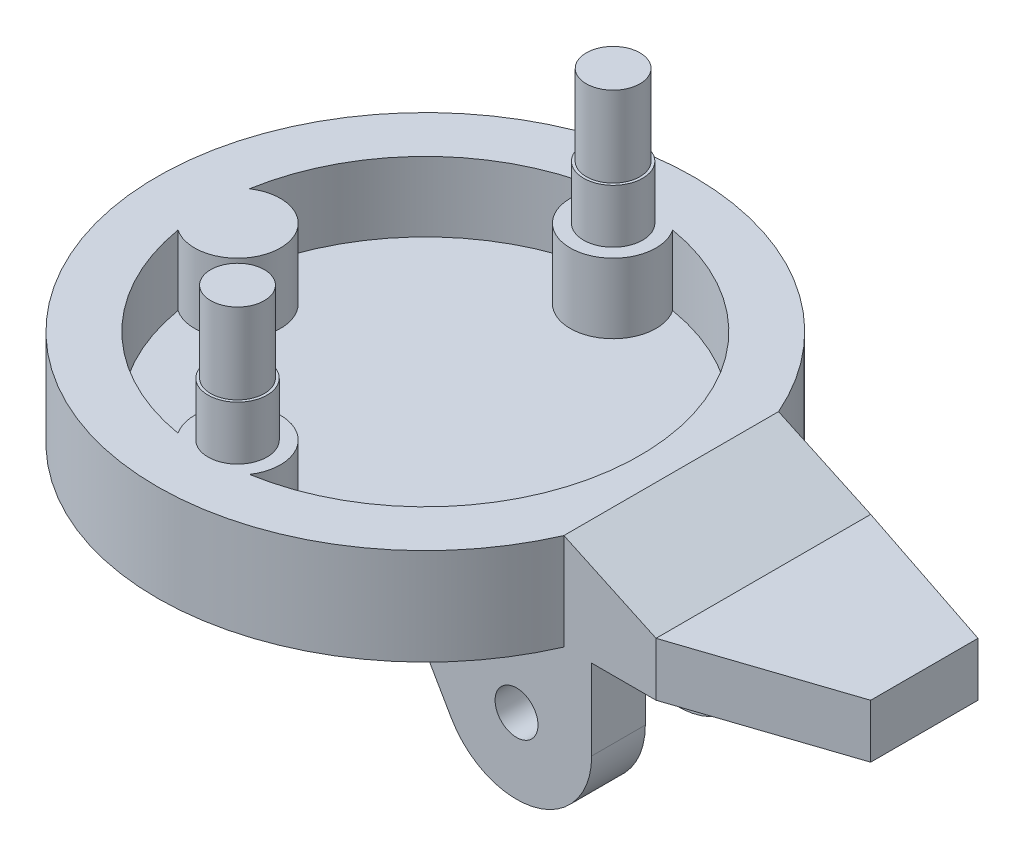
ISO-10303-21;
HEADER;
FILE_DESCRIPTION(('STEP AP214'),'2;1');
FILE_NAME('part.step','',(''),(''),'','','');
FILE_SCHEMA(('AUTOMOTIVE_DESIGN { 1 0 10303 214 1 1 1 1 }'));
ENDSEC;
DATA;
#1=APPLICATION_CONTEXT('core data for automotive mechanical design processes');
#2=APPLICATION_PROTOCOL_DEFINITION('international standard','automotive_design',2000,#1);
#3=PRODUCT_CONTEXT('',#1,'mechanical');
#4=PRODUCT('Part','Part','',(#3));
#5=PRODUCT_RELATED_PRODUCT_CATEGORY('part','',(#4));
#6=PRODUCT_DEFINITION_FORMATION('','',#4);
#7=PRODUCT_DEFINITION_CONTEXT('part definition',#1,'design');
#8=PRODUCT_DEFINITION('design','',#6,#7);
#9=PRODUCT_DEFINITION_SHAPE('','',#8);
#10=(LENGTH_UNIT() NAMED_UNIT(*) SI_UNIT(.MILLI.,.METRE.));
#11=(NAMED_UNIT(*) PLANE_ANGLE_UNIT() SI_UNIT($,.RADIAN.));
#12=(NAMED_UNIT(*) SI_UNIT($,.STERADIAN.) SOLID_ANGLE_UNIT());
#13=UNCERTAINTY_MEASURE_WITH_UNIT(LENGTH_MEASURE(1.E-05),#10,'distance_accuracy_value','');
#14=(GEOMETRIC_REPRESENTATION_CONTEXT(3) GLOBAL_UNCERTAINTY_ASSIGNED_CONTEXT((#13)) GLOBAL_UNIT_ASSIGNED_CONTEXT((#10,
#11,#12)) REPRESENTATION_CONTEXT('',''));
#15=CARTESIAN_POINT('',(0.,0.,0.));
#16=DIRECTION('',(0.,0.,1.));
#17=DIRECTION('',(1.,0.,0.));
#18=AXIS2_PLACEMENT_3D('',#15,#16,#17);
#19=CARTESIAN_POINT('',(0.,0.,0.));
#20=DIRECTION('',(0.,1.,0.));
#21=DIRECTION('',(0.,0.,1.));
#22=AXIS2_PLACEMENT_3D('',#19,#20,#21);
#23=PLANE('',#22);
#24=CARTESIAN_POINT('',(0.,0.,0.));
#25=DIRECTION('',(0.,1.,0.));
#26=DIRECTION('',(0.,0.,1.));
#27=AXIS2_PLACEMENT_3D('',#24,#25,#26);
#28=CIRCLE('',#27,50.);
#29=CARTESIAN_POINT('',(45.8257569495584,0.,-20.));
#30=VERTEX_POINT('',#29);
#31=CARTESIAN_POINT('',(45.8257569495584,0.,20.));
#32=VERTEX_POINT('',#31);
#33=EDGE_CURVE('E47',#30,#32,#28,.T.);
#34=ORIENTED_EDGE('',*,*,#33,.F.);
#35=DIRECTION('',(-1.,0.,0.));
#36=VECTOR('',#35,1.);
#37=CARTESIAN_POINT('',(12.1739384248461,0.,-20.));
#38=LINE('',#37,#36);
#39=CARTESIAN_POINT('',(12.1739384248461,0.,-20.));
#40=VERTEX_POINT('',#39);
#41=EDGE_CURVE('E60',#30,#40,#38,.T.);
#42=ORIENTED_EDGE('',*,*,#41,.T.);
#43=DIRECTION('',(0.,0.,1.));
#44=VECTOR('',#43,1.);
#45=CARTESIAN_POINT('',(12.1739384248461,0.,-20.));
#46=LINE('',#45,#44);
#47=CARTESIAN_POINT('',(12.1739384248461,0.,-10.));
#48=VERTEX_POINT('',#47);
#49=EDGE_CURVE('E64',#40,#48,#46,.T.);
#50=ORIENTED_EDGE('',*,*,#49,.T.);
#51=DIRECTION('',(-1.,0.,0.));
#52=VECTOR('',#51,1.);
#53=CARTESIAN_POINT('',(12.1739384248461,0.,-10.));
#54=LINE('',#53,#52);
#55=CARTESIAN_POINT('',(50.9999999999999,0.,-10.));
#56=VERTEX_POINT('',#55);
#57=EDGE_CURVE('E197',#56,#48,#54,.T.);
#58=ORIENTED_EDGE('',*,*,#57,.F.);
#59=DIRECTION('',(0.,0.,1.));
#60=VECTOR('',#59,1.);
#61=CARTESIAN_POINT('',(50.9999999999999,0.,-20.));
#62=LINE('',#61,#60);
#63=CARTESIAN_POINT('',(50.9999999999999,0.,-20.));
#64=VERTEX_POINT('',#63);
#65=EDGE_CURVE('E195',#64,#56,#62,.T.);
#66=ORIENTED_EDGE('',*,*,#65,.F.);
#67=DIRECTION('',(1.,0.,0.));
#68=VECTOR('',#67,1.);
#69=CARTESIAN_POINT('',(-50.002,0.,-20.));
#70=LINE('',#69,#68);
#71=CARTESIAN_POINT('',(63.,0.,-20.));
#72=VERTEX_POINT('',#71);
#73=EDGE_CURVE('E179',#64,#72,#70,.T.);
#74=ORIENTED_EDGE('',*,*,#73,.T.);
#75=DIRECTION('',(0.948683298050514,0.,0.316227766016838));
#76=VECTOR('',#75,1.);
#77=CARTESIAN_POINT('',(63.,0.,-20.));
#78=LINE('',#77,#76);
#79=CARTESIAN_POINT('',(93.,0.,-10.));
#80=VERTEX_POINT('',#79);
#81=EDGE_CURVE('E262',#72,#80,#78,.T.);
#82=ORIENTED_EDGE('',*,*,#81,.T.);
#83=DIRECTION('',(0.,0.,-1.));
#84=VECTOR('',#83,1.);
#85=CARTESIAN_POINT('',(93.,0.,20.));
#86=LINE('',#85,#84);
#87=CARTESIAN_POINT('',(92.9999999999999,0.,10.));
#88=VERTEX_POINT('',#87);
#89=EDGE_CURVE('E192',#88,#80,#86,.T.);
#90=ORIENTED_EDGE('',*,*,#89,.F.);
#91=DIRECTION('',(-0.948683298050514,0.,0.316227766016838));
#92=VECTOR('',#91,1.);
#93=CARTESIAN_POINT('',(62.9999999999999,0.,20.));
#94=LINE('',#93,#92);
#95=CARTESIAN_POINT('',(62.9999999999999,0.,20.));
#96=VERTEX_POINT('',#95);
#97=EDGE_CURVE('E275',#88,#96,#94,.T.);
#98=ORIENTED_EDGE('',*,*,#97,.T.);
#99=DIRECTION('',(1.,0.,0.));
#100=VECTOR('',#99,1.);
#101=CARTESIAN_POINT('',(-50.002,0.,20.));
#102=LINE('',#101,#100);
#103=CARTESIAN_POINT('',(50.9999999999999,0.,20.));
#104=VERTEX_POINT('',#103);
#105=EDGE_CURVE('E191',#104,#96,#102,.T.);
#106=ORIENTED_EDGE('',*,*,#105,.F.);
#107=DIRECTION('',(0.,0.,-1.));
#108=VECTOR('',#107,1.);
#109=CARTESIAN_POINT('',(50.9999999999999,0.,20.));
#110=LINE('',#109,#108);
#111=CARTESIAN_POINT('',(50.9999999999999,0.,10.));
#112=VERTEX_POINT('',#111);
#113=EDGE_CURVE('E241',#104,#112,#110,.T.);
#114=ORIENTED_EDGE('',*,*,#113,.T.);
#115=DIRECTION('',(-1.,0.,0.));
#116=VECTOR('',#115,1.);
#117=CARTESIAN_POINT('',(12.1739384248461,0.,10.));
#118=LINE('',#117,#116);
#119=CARTESIAN_POINT('',(12.1739384248461,0.,10.));
#120=VERTEX_POINT('',#119);
#121=EDGE_CURVE('E231',#112,#120,#118,.T.);
#122=ORIENTED_EDGE('',*,*,#121,.T.);
#123=DIRECTION('',(0.,0.,-1.));
#124=VECTOR('',#123,1.);
#125=CARTESIAN_POINT('',(12.1739384248461,0.,20.));
#126=LINE('',#125,#124);
#127=CARTESIAN_POINT('',(12.1739384248461,0.,20.));
#128=VERTEX_POINT('',#127);
#129=EDGE_CURVE('E258',#128,#120,#126,.T.);
#130=ORIENTED_EDGE('',*,*,#129,.F.);
#131=DIRECTION('',(-1.,0.,0.));
#132=VECTOR('',#131,1.);
#133=CARTESIAN_POINT('',(12.1739384248461,0.,20.));
#134=LINE('',#133,#132);
#135=EDGE_CURVE('E11',#32,#128,#134,.T.);
#136=ORIENTED_EDGE('',*,*,#135,.F.);
#137=EDGE_LOOP('',(#34,#42,#50,#58,#66,#74,#82,#90,#98,#106,#114,#122,#130,#136));
#138=FACE_BOUND('',#137,.T.);
#139=CARTESIAN_POINT('',(1.2220184685951E-13,0.,35.));
#140=DIRECTION('',(0.,-1.,0.));
#141=DIRECTION('',(0.,0.,-1.));
#142=AXIS2_PLACEMENT_3D('',#139,#140,#141);
#143=CIRCLE('',#142,4.);
#144=CARTESIAN_POINT('',(1.2220184685951E-13,0.,31.));
#145=VERTEX_POINT('',#144);
#146=EDGE_CURVE('E305',#145,#145,#143,.T.);
#147=ORIENTED_EDGE('',*,*,#146,.F.);
#148=EDGE_LOOP('',(#147));
#149=FACE_BOUND('',#148,.T.);
#150=CARTESIAN_POINT('',(-3.66605540578529E-13,0.,-35.));
#151=DIRECTION('',(0.,-1.,0.));
#152=DIRECTION('',(0.,0.,-1.));
#153=AXIS2_PLACEMENT_3D('',#150,#151,#152);
#154=CIRCLE('',#153,4.);
#155=CARTESIAN_POINT('',(-3.66605540578529E-13,0.,-39.));
#156=VERTEX_POINT('',#155);
#157=EDGE_CURVE('E308',#156,#156,#154,.T.);
#158=ORIENTED_EDGE('',*,*,#157,.F.);
#159=EDGE_LOOP('',(#158));
#160=FACE_BOUND('',#159,.T.);
#161=CARTESIAN_POINT('',(-35.,0.,0.));
#162=DIRECTION('',(0.,-1.,0.));
#163=DIRECTION('',(0.,0.,-1.));
#164=AXIS2_PLACEMENT_3D('',#161,#162,#163);
#165=CIRCLE('',#164,4.);
#166=CARTESIAN_POINT('',(-35.,0.,-4.));
#167=VERTEX_POINT('',#166);
#168=EDGE_CURVE('E301',#167,#167,#165,.T.);
#169=ORIENTED_EDGE('',*,*,#168,.F.);
#170=EDGE_LOOP('',(#169));
#171=FACE_BOUND('',#170,.T.);
#172=ADVANCED_FACE('F43',(#138,#149,#160,#171),#23,.F.);
#173=CARTESIAN_POINT('',(0.,18.,0.));
#174=DIRECTION('',(0.,1.,0.));
#175=DIRECTION('',(0.,0.,1.));
#176=AXIS2_PLACEMENT_3D('',#173,#174,#175);
#177=PLANE('',#176);
#178=DIRECTION('',(0.,0.,1.));
#179=VECTOR('',#178,1.);
#180=CARTESIAN_POINT('',(45.8257569495584,18.,-50.));
#181=LINE('',#180,#179);
#182=CARTESIAN_POINT('',(45.8257569495584,18.,-20.));
#183=VERTEX_POINT('',#182);
#184=CARTESIAN_POINT('',(45.8257569495584,18.,20.));
#185=VERTEX_POINT('',#184);
#186=EDGE_CURVE('E282',#183,#185,#181,.T.);
#187=ORIENTED_EDGE('',*,*,#186,.F.);
#188=CARTESIAN_POINT('',(0.,18.,0.));
#189=DIRECTION('',(0.,1.,0.));
#190=DIRECTION('',(0.,0.,1.));
#191=AXIS2_PLACEMENT_3D('',#188,#189,#190);
#192=CIRCLE('',#191,50.);
#193=EDGE_CURVE('E327',#183,#185,#192,.T.);
#194=ORIENTED_EDGE('',*,*,#193,.T.);
#195=EDGE_LOOP('',(#187,#194));
#196=FACE_BOUND('',#195,.T.);
#197=CARTESIAN_POINT('',(-3.66605540578529E-13,18.,35.));
#198=DIRECTION('',(0.,1.,0.));
#199=DIRECTION('',(0.,0.,1.));
#200=AXIS2_PLACEMENT_3D('',#197,#198,#199);
#201=CIRCLE('',#200,5.5);
#202=CARTESIAN_POINT('',(-3.66605540578529E-13,18.,40.5));
#203=VERTEX_POINT('',#202);
#204=EDGE_CURVE('E336',#203,#203,#201,.T.);
#205=ORIENTED_EDGE('',*,*,#204,.F.);
#206=EDGE_LOOP('',(#205));
#207=FACE_BOUND('',#206,.T.);
#208=CARTESIAN_POINT('',(6.10622663543836E-13,18.,-35.));
#209=DIRECTION('',(0.,1.,0.));
#210=DIRECTION('',(0.,0.,1.));
#211=AXIS2_PLACEMENT_3D('',#208,#209,#210);
#212=CIRCLE('',#211,5.5);
#213=CARTESIAN_POINT('',(6.10622663543836E-13,18.,-29.5));
#214=VERTEX_POINT('',#213);
#215=EDGE_CURVE('E323',#214,#214,#212,.T.);
#216=ORIENTED_EDGE('',*,*,#215,.F.);
#217=EDGE_LOOP('',(#216));
#218=FACE_BOUND('',#217,.T.);
#219=CARTESIAN_POINT('',(-3.66605540578529E-13,18.,35.));
#220=DIRECTION('',(0.,1.,0.));
#221=DIRECTION('',(0.,0.,1.));
#222=AXIS2_PLACEMENT_3D('',#219,#220,#221);
#223=CIRCLE('',#222,8.);
#224=CARTESIAN_POINT('',(6.6528956408588,18.,39.4428571428572));
#225=VERTEX_POINT('',#224);
#226=CARTESIAN_POINT('',(-6.65289564085963,18.,39.4428571428571));
#227=VERTEX_POINT('',#226);
#228=EDGE_CURVE('E344',#225,#227,#223,.T.);
#229=ORIENTED_EDGE('',*,*,#228,.T.);
#230=CARTESIAN_POINT('',(0.,18.,0.));
#231=DIRECTION('',(0.,1.,0.));
#232=DIRECTION('',(0.,0.,1.));
#233=AXIS2_PLACEMENT_3D('',#230,#231,#232);
#234=CIRCLE('',#233,40.);
#235=CARTESIAN_POINT('',(-39.4428571428571,18.,6.65289564085921));
#236=VERTEX_POINT('',#235);
#237=EDGE_CURVE('E351',#236,#227,#234,.T.);
#238=ORIENTED_EDGE('',*,*,#237,.F.);
#239=CARTESIAN_POINT('',(-35.,18.,0.));
#240=DIRECTION('',(0.,1.,0.));
#241=DIRECTION('',(0.,0.,1.));
#242=AXIS2_PLACEMENT_3D('',#239,#240,#241);
#243=CIRCLE('',#242,8.);
#244=CARTESIAN_POINT('',(-39.4428571428571,18.,-6.65289564085921));
#245=VERTEX_POINT('',#244);
#246=EDGE_CURVE('E355',#236,#245,#243,.T.);
#247=ORIENTED_EDGE('',*,*,#246,.T.);
#248=CARTESIAN_POINT('',(-6.65289564085853,18.,-39.4428571428573));
#249=VERTEX_POINT('',#248);
#250=EDGE_CURVE('E352',#249,#245,#234,.T.);
#251=ORIENTED_EDGE('',*,*,#250,.F.);
#252=CARTESIAN_POINT('',(6.10622663543836E-13,18.,-35.));
#253=DIRECTION('',(0.,1.,0.));
#254=DIRECTION('',(0.,0.,1.));
#255=AXIS2_PLACEMENT_3D('',#252,#253,#254);
#256=CIRCLE('',#255,8.);
#257=CARTESIAN_POINT('',(6.6528956408599,18.,-39.442857142857));
#258=VERTEX_POINT('',#257);
#259=EDGE_CURVE('E350',#249,#258,#256,.T.);
#260=ORIENTED_EDGE('',*,*,#259,.T.);
#261=EDGE_CURVE('E347',#225,#258,#234,.T.);
#262=ORIENTED_EDGE('',*,*,#261,.F.);
#263=EDGE_LOOP('',(#229,#238,#247,#251,#260,#262));
#264=FACE_BOUND('',#263,.T.);
#265=ADVANCED_FACE('F398',(#196,#207,#218,#264),#177,.T.);
#266=CARTESIAN_POINT('',(0.,18.,0.));
#267=DIRECTION('',(0.,-1.,0.));
#268=DIRECTION('',(0.,0.,-1.));
#269=AXIS2_PLACEMENT_3D('',#266,#267,#268);
#270=CYLINDRICAL_SURFACE('',#269,50.);
#271=ORIENTED_EDGE('',*,*,#193,.F.);
#272=DIRECTION('',(0.,-1.,0.));
#273=VECTOR('',#272,1.);
#274=CARTESIAN_POINT('',(45.8257569495584,18.,-20.));
#275=LINE('',#274,#273);
#276=EDGE_CURVE('E295',#30,#183,#275,.F.);
#277=ORIENTED_EDGE('',*,*,#276,.F.);
#278=ORIENTED_EDGE('',*,*,#33,.T.);
#279=DIRECTION('',(0.,-1.,0.));
#280=VECTOR('',#279,1.);
#281=CARTESIAN_POINT('',(45.8257569495584,18.,20.));
#282=LINE('',#281,#280);
#283=EDGE_CURVE('E298',#185,#32,#282,.T.);
#284=ORIENTED_EDGE('',*,*,#283,.F.);
#285=EDGE_LOOP('',(#271,#277,#278,#284));
#286=FACE_BOUND('',#285,.T.);
#287=ADVANCED_FACE('F45',(#286),#270,.T.);
#288=CARTESIAN_POINT('',(-3.66605540578529E-13,18.,35.));
#289=DIRECTION('',(0.,-1.,0.));
#290=DIRECTION('',(0.,0.,-1.));
#291=AXIS2_PLACEMENT_3D('',#288,#289,#290);
#292=CYLINDRICAL_SURFACE('',#291,8.);
#293=CARTESIAN_POINT('',(-3.66605540578529E-13,5.,35.));
#294=DIRECTION('',(0.,1.,0.));
#295=DIRECTION('',(0.,0.,1.));
#296=AXIS2_PLACEMENT_3D('',#293,#294,#295);
#297=CIRCLE('',#296,8.);
#298=CARTESIAN_POINT('',(6.6528956408588,5.,39.4428571428572));
#299=VERTEX_POINT('',#298);
#300=CARTESIAN_POINT('',(-6.65289564085963,5.,39.4428571428571));
#301=VERTEX_POINT('',#300);
#302=EDGE_CURVE('E335',#299,#301,#297,.T.);
#303=ORIENTED_EDGE('',*,*,#302,.T.);
#304=DIRECTION('',(0.,-1.,0.));
#305=VECTOR('',#304,1.);
#306=CARTESIAN_POINT('',(-6.65289564085963,18.,39.4428571428571));
#307=LINE('',#306,#305);
#308=EDGE_CURVE('E370',#227,#301,#307,.T.);
#309=ORIENTED_EDGE('',*,*,#308,.F.);
#310=ORIENTED_EDGE('',*,*,#228,.F.);
#311=DIRECTION('',(0.,-1.,0.));
#312=VECTOR('',#311,1.);
#313=CARTESIAN_POINT('',(6.6528956408588,18.,39.4428571428572));
#314=LINE('',#313,#312);
#315=EDGE_CURVE('E380',#225,#299,#314,.T.);
#316=ORIENTED_EDGE('',*,*,#315,.T.);
#317=EDGE_LOOP('',(#303,#309,#310,#316));
#318=FACE_BOUND('',#317,.T.);
#319=ADVANCED_FACE('F426',(#318),#292,.T.);
#320=CARTESIAN_POINT('',(0.,18.,0.));
#321=DIRECTION('',(0.,-1.,0.));
#322=DIRECTION('',(0.,0.,-1.));
#323=AXIS2_PLACEMENT_3D('',#320,#321,#322);
#324=CYLINDRICAL_SURFACE('',#323,40.);
#325=CARTESIAN_POINT('',(0.,5.,0.));
#326=DIRECTION('',(0.,1.,0.));
#327=DIRECTION('',(0.,0.,1.));
#328=AXIS2_PLACEMENT_3D('',#325,#326,#327);
#329=CIRCLE('',#328,40.);
#330=CARTESIAN_POINT('',(6.6528956408599,5.,-39.442857142857));
#331=VERTEX_POINT('',#330);
#332=EDGE_CURVE('E360',#299,#331,#329,.T.);
#333=ORIENTED_EDGE('',*,*,#332,.F.);
#334=ORIENTED_EDGE('',*,*,#315,.F.);
#335=ORIENTED_EDGE('',*,*,#261,.T.);
#336=DIRECTION('',(0.,-1.,0.));
#337=VECTOR('',#336,1.);
#338=CARTESIAN_POINT('',(6.6528956408599,18.,-39.442857142857));
#339=LINE('',#338,#337);
#340=EDGE_CURVE('E378',#258,#331,#339,.T.);
#341=ORIENTED_EDGE('',*,*,#340,.T.);
#342=EDGE_LOOP('',(#333,#334,#335,#341));
#343=FACE_BOUND('',#342,.T.);
#344=ADVANCED_FACE('F429',(#343),#324,.F.);
#345=CARTESIAN_POINT('',(6.10622663543836E-13,18.,-35.));
#346=DIRECTION('',(0.,-1.,0.));
#347=DIRECTION('',(0.,0.,-1.));
#348=AXIS2_PLACEMENT_3D('',#345,#346,#347);
#349=CYLINDRICAL_SURFACE('',#348,8.);
#350=CARTESIAN_POINT('',(6.10622663543836E-13,5.,-35.));
#351=DIRECTION('',(0.,1.,0.));
#352=DIRECTION('',(0.,0.,1.));
#353=AXIS2_PLACEMENT_3D('',#350,#351,#352);
#354=CIRCLE('',#353,8.);
#355=CARTESIAN_POINT('',(-6.65289564085853,5.,-39.4428571428573));
#356=VERTEX_POINT('',#355);
#357=EDGE_CURVE('E363',#356,#331,#354,.T.);
#358=ORIENTED_EDGE('',*,*,#357,.T.);
#359=ORIENTED_EDGE('',*,*,#340,.F.);
#360=ORIENTED_EDGE('',*,*,#259,.F.);
#361=DIRECTION('',(0.,-1.,0.));
#362=VECTOR('',#361,1.);
#363=CARTESIAN_POINT('',(-6.65289564085853,18.,-39.4428571428573));
#364=LINE('',#363,#362);
#365=EDGE_CURVE('E376',#249,#356,#364,.T.);
#366=ORIENTED_EDGE('',*,*,#365,.T.);
#367=EDGE_LOOP('',(#358,#359,#360,#366));
#368=FACE_BOUND('',#367,.T.);
#369=ADVANCED_FACE('F431',(#368),#349,.T.);
#370=CARTESIAN_POINT('',(-39.4428571428571,5.,-6.65289564085921));
#371=VERTEX_POINT('',#370);
#372=EDGE_CURVE('E364',#356,#371,#329,.T.);
#373=ORIENTED_EDGE('',*,*,#372,.F.);
#374=ORIENTED_EDGE('',*,*,#365,.F.);
#375=ORIENTED_EDGE('',*,*,#250,.T.);
#376=DIRECTION('',(0.,-1.,0.));
#377=VECTOR('',#376,1.);
#378=CARTESIAN_POINT('',(-39.4428571428571,18.,-6.65289564085921));
#379=LINE('',#378,#377);
#380=EDGE_CURVE('E374',#245,#371,#379,.T.);
#381=ORIENTED_EDGE('',*,*,#380,.T.);
#382=EDGE_LOOP('',(#373,#374,#375,#381));
#383=FACE_BOUND('',#382,.T.);
#384=ADVANCED_FACE('F434',(#383),#324,.F.);
#385=CARTESIAN_POINT('',(-35.,18.,0.));
#386=DIRECTION('',(0.,-1.,0.));
#387=DIRECTION('',(0.,0.,-1.));
#388=AXIS2_PLACEMENT_3D('',#385,#386,#387);
#389=CYLINDRICAL_SURFACE('',#388,8.);
#390=CARTESIAN_POINT('',(-35.,5.,0.));
#391=DIRECTION('',(0.,1.,0.));
#392=DIRECTION('',(0.,0.,1.));
#393=AXIS2_PLACEMENT_3D('',#390,#391,#392);
#394=CIRCLE('',#393,8.);
#395=CARTESIAN_POINT('',(-39.4428571428571,5.,6.65289564085921));
#396=VERTEX_POINT('',#395);
#397=EDGE_CURVE('E367',#396,#371,#394,.T.);
#398=ORIENTED_EDGE('',*,*,#397,.T.);
#399=ORIENTED_EDGE('',*,*,#380,.F.);
#400=ORIENTED_EDGE('',*,*,#246,.F.);
#401=DIRECTION('',(0.,-1.,0.));
#402=VECTOR('',#401,1.);
#403=CARTESIAN_POINT('',(-39.4428571428571,18.,6.65289564085921));
#404=LINE('',#403,#402);
#405=EDGE_CURVE('E372',#236,#396,#404,.T.);
#406=ORIENTED_EDGE('',*,*,#405,.T.);
#407=EDGE_LOOP('',(#398,#399,#400,#406));
#408=FACE_BOUND('',#407,.T.);
#409=ADVANCED_FACE('F436',(#408),#389,.T.);
#410=EDGE_CURVE('E348',#396,#301,#329,.T.);
#411=ORIENTED_EDGE('',*,*,#410,.F.);
#412=ORIENTED_EDGE('',*,*,#405,.F.);
#413=ORIENTED_EDGE('',*,*,#237,.T.);
#414=ORIENTED_EDGE('',*,*,#308,.T.);
#415=EDGE_LOOP('',(#411,#412,#413,#414));
#416=FACE_BOUND('',#415,.T.);
#417=ADVANCED_FACE('F439',(#416),#324,.F.);
#418=CARTESIAN_POINT('',(0.,5.,0.));
#419=DIRECTION('',(0.,1.,0.));
#420=DIRECTION('',(0.,0.,1.));
#421=AXIS2_PLACEMENT_3D('',#418,#419,#420);
#422=PLANE('',#421);
#423=ORIENTED_EDGE('',*,*,#302,.F.);
#424=ORIENTED_EDGE('',*,*,#332,.T.);
#425=ORIENTED_EDGE('',*,*,#357,.F.);
#426=ORIENTED_EDGE('',*,*,#372,.T.);
#427=ORIENTED_EDGE('',*,*,#397,.F.);
#428=ORIENTED_EDGE('',*,*,#410,.T.);
#429=EDGE_LOOP('',(#423,#424,#425,#426,#427,#428));
#430=FACE_BOUND('',#429,.T.);
#431=ADVANCED_FACE('F443',(#430),#422,.T.);
#432=CARTESIAN_POINT('',(6.10622663543836E-13,28.,-35.));
#433=DIRECTION('',(0.,-1.,0.));
#434=DIRECTION('',(0.,0.,-1.));
#435=AXIS2_PLACEMENT_3D('',#432,#433,#434);
#436=CYLINDRICAL_SURFACE('',#435,5.5);
#437=CARTESIAN_POINT('',(6.10622663543836E-13,28.,-35.));
#438=DIRECTION('',(0.,1.,0.));
#439=DIRECTION('',(0.,0.,1.));
#440=AXIS2_PLACEMENT_3D('',#437,#438,#439);
#441=CIRCLE('',#440,5.5);
#442=CARTESIAN_POINT('',(6.10622663543836E-13,28.,-29.5));
#443=VERTEX_POINT('',#442);
#444=EDGE_CURVE('E339',#443,#443,#441,.T.);
#445=ORIENTED_EDGE('',*,*,#444,.F.);
#446=EDGE_LOOP('',(#445));
#447=FACE_BOUND('',#446,.T.);
#448=ORIENTED_EDGE('',*,*,#215,.T.);
#449=EDGE_LOOP('',(#448));
#450=FACE_BOUND('',#449,.T.);
#451=ADVANCED_FACE('F447',(#447,#450),#436,.T.);
#452=CARTESIAN_POINT('',(6.10622663543836E-13,28.,-35.));
#453=DIRECTION('',(0.,1.,0.));
#454=DIRECTION('',(0.,0.,1.));
#455=AXIS2_PLACEMENT_3D('',#452,#453,#454);
#456=PLANE('',#455);
#457=CARTESIAN_POINT('',(6.10622663543836E-13,28.,-35.));
#458=DIRECTION('',(0.,1.,0.));
#459=DIRECTION('',(0.,0.,1.));
#460=AXIS2_PLACEMENT_3D('',#457,#458,#459);
#461=CIRCLE('',#460,5.);
#462=CARTESIAN_POINT('',(6.10622663543836E-13,28.,-30.));
#463=VERTEX_POINT('',#462);
#464=EDGE_CURVE('E52',#463,#463,#461,.T.);
#465=ORIENTED_EDGE('',*,*,#464,.F.);
#466=EDGE_LOOP('',(#465));
#467=FACE_BOUND('',#466,.T.);
#468=ORIENTED_EDGE('',*,*,#444,.T.);
#469=EDGE_LOOP('',(#468));
#470=FACE_BOUND('',#469,.T.);
#471=ADVANCED_FACE('F451',(#467,#470),#456,.T.);
#472=CARTESIAN_POINT('',(-3.66605540578529E-13,28.,35.));
#473=DIRECTION('',(0.,-1.,0.));
#474=DIRECTION('',(0.,0.,-1.));
#475=AXIS2_PLACEMENT_3D('',#472,#473,#474);
#476=CYLINDRICAL_SURFACE('',#475,5.5);
#477=CARTESIAN_POINT('',(-3.66605540578529E-13,28.,35.));
#478=DIRECTION('',(0.,1.,0.));
#479=DIRECTION('',(0.,0.,1.));
#480=AXIS2_PLACEMENT_3D('',#477,#478,#479);
#481=CIRCLE('',#480,5.5);
#482=CARTESIAN_POINT('',(-3.66605540578529E-13,28.,40.5));
#483=VERTEX_POINT('',#482);
#484=EDGE_CURVE('E332',#483,#483,#481,.T.);
#485=ORIENTED_EDGE('',*,*,#484,.F.);
#486=EDGE_LOOP('',(#485));
#487=FACE_BOUND('',#486,.T.);
#488=ORIENTED_EDGE('',*,*,#204,.T.);
#489=EDGE_LOOP('',(#488));
#490=FACE_BOUND('',#489,.T.);
#491=ADVANCED_FACE('F455',(#487,#490),#476,.T.);
#492=CARTESIAN_POINT('',(-3.66605540578529E-13,28.,35.));
#493=DIRECTION('',(0.,1.,0.));
#494=DIRECTION('',(0.,0.,1.));
#495=AXIS2_PLACEMENT_3D('',#492,#493,#494);
#496=PLANE('',#495);
#497=CARTESIAN_POINT('',(-3.66605540578529E-13,28.,35.));
#498=DIRECTION('',(0.,1.,0.));
#499=DIRECTION('',(0.,0.,1.));
#500=AXIS2_PLACEMENT_3D('',#497,#498,#499);
#501=CIRCLE('',#500,5.);
#502=CARTESIAN_POINT('',(-3.66605540578529E-13,28.,40.));
#503=VERTEX_POINT('',#502);
#504=EDGE_CURVE('E324',#503,#503,#501,.T.);
#505=ORIENTED_EDGE('',*,*,#504,.F.);
#506=EDGE_LOOP('',(#505));
#507=FACE_BOUND('',#506,.T.);
#508=ORIENTED_EDGE('',*,*,#484,.T.);
#509=EDGE_LOOP('',(#508));
#510=FACE_BOUND('',#509,.T.);
#511=ADVANCED_FACE('F459',(#507,#510),#496,.T.);
#512=CARTESIAN_POINT('',(-3.66605540578529E-13,43.,35.));
#513=DIRECTION('',(0.,-1.,0.));
#514=DIRECTION('',(0.,0.,-1.));
#515=AXIS2_PLACEMENT_3D('',#512,#513,#514);
#516=CYLINDRICAL_SURFACE('',#515,5.);
#517=CARTESIAN_POINT('',(-3.66605540578529E-13,43.,35.));
#518=DIRECTION('',(0.,1.,0.));
#519=DIRECTION('',(0.,0.,1.));
#520=AXIS2_PLACEMENT_3D('',#517,#518,#519);
#521=CIRCLE('',#520,5.);
#522=CARTESIAN_POINT('',(-3.66605540578529E-13,43.,40.));
#523=VERTEX_POINT('',#522);
#524=EDGE_CURVE('E320',#523,#523,#521,.T.);
#525=ORIENTED_EDGE('',*,*,#524,.F.);
#526=EDGE_LOOP('',(#525));
#527=FACE_BOUND('',#526,.T.);
#528=ORIENTED_EDGE('',*,*,#504,.T.);
#529=EDGE_LOOP('',(#528));
#530=FACE_BOUND('',#529,.T.);
#531=ADVANCED_FACE('F463',(#527,#530),#516,.T.);
#532=CARTESIAN_POINT('',(-3.66605540578529E-13,43.,35.));
#533=DIRECTION('',(0.,1.,0.));
#534=DIRECTION('',(0.,0.,1.));
#535=AXIS2_PLACEMENT_3D('',#532,#533,#534);
#536=PLANE('',#535);
#537=ORIENTED_EDGE('',*,*,#524,.T.);
#538=EDGE_LOOP('',(#537));
#539=FACE_BOUND('',#538,.T.);
#540=ADVANCED_FACE('F469',(#539),#536,.T.);
#541=CARTESIAN_POINT('',(6.10622663543836E-13,43.,-35.));
#542=DIRECTION('',(0.,-1.,0.));
#543=DIRECTION('',(0.,0.,-1.));
#544=AXIS2_PLACEMENT_3D('',#541,#542,#543);
#545=CYLINDRICAL_SURFACE('',#544,5.);
#546=CARTESIAN_POINT('',(6.10622663543836E-13,43.,-35.));
#547=DIRECTION('',(0.,1.,0.));
#548=DIRECTION('',(0.,0.,1.));
#549=AXIS2_PLACEMENT_3D('',#546,#547,#548);
#550=CIRCLE('',#549,5.);
#551=CARTESIAN_POINT('',(6.10622663543836E-13,43.,-30.));
#552=VERTEX_POINT('',#551);
#553=EDGE_CURVE('E315',#552,#552,#550,.T.);
#554=ORIENTED_EDGE('',*,*,#553,.F.);
#555=EDGE_LOOP('',(#554));
#556=FACE_BOUND('',#555,.T.);
#557=ORIENTED_EDGE('',*,*,#464,.T.);
#558=EDGE_LOOP('',(#557));
#559=FACE_BOUND('',#558,.T.);
#560=ADVANCED_FACE('F465',(#556,#559),#545,.T.);
#561=CARTESIAN_POINT('',(6.10622663543836E-13,43.,-35.));
#562=DIRECTION('',(0.,1.,0.));
#563=DIRECTION('',(0.,0.,1.));
#564=AXIS2_PLACEMENT_3D('',#561,#562,#563);
#565=PLANE('',#564);
#566=ORIENTED_EDGE('',*,*,#553,.T.);
#567=EDGE_LOOP('',(#566));
#568=FACE_BOUND('',#567,.T.);
#569=ADVANCED_FACE('F468',(#568),#565,.T.);
#570=CARTESIAN_POINT('',(0.,18.,0.));
#571=DIRECTION('',(0.,1.,0.));
#572=DIRECTION('',(0.,0.,1.));
#573=AXIS2_PLACEMENT_3D('',#570,#571,#572);
#574=PLANE('',#573);
#575=CARTESIAN_POINT('',(1.2220184685951E-13,18.,35.));
#576=DIRECTION('',(0.,1.,0.));
#577=DIRECTION('',(0.,0.,1.));
#578=AXIS2_PLACEMENT_3D('',#575,#576,#577);
#579=CIRCLE('',#578,4.);
#580=CARTESIAN_POINT('',(1.2220184685951E-13,18.,39.));
#581=VERTEX_POINT('',#580);
#582=EDGE_CURVE('E312',#581,#581,#579,.F.);
#583=ORIENTED_EDGE('',*,*,#582,.T.);
#584=EDGE_LOOP('',(#583));
#585=FACE_BOUND('',#584,.T.);
#586=ADVANCED_FACE('F473',(#585),#574,.F.);
#587=CARTESIAN_POINT('',(1.2220184685951E-13,29.3137084989848,35.));
#588=DIRECTION('',(0.,-1.,0.));
#589=DIRECTION('',(0.,0.,-1.));
#590=AXIS2_PLACEMENT_3D('',#587,#588,#589);
#591=CYLINDRICAL_SURFACE('',#590,4.);
#592=ORIENTED_EDGE('',*,*,#146,.T.);
#593=EDGE_LOOP('',(#592));
#594=FACE_BOUND('',#593,.T.);
#595=ORIENTED_EDGE('',*,*,#582,.F.);
#596=EDGE_LOOP('',(#595));
#597=FACE_BOUND('',#596,.T.);
#598=ADVANCED_FACE('F483',(#594,#597),#591,.F.);
#599=CARTESIAN_POINT('',(0.,18.,0.));
#600=DIRECTION('',(0.,1.,0.));
#601=DIRECTION('',(0.,0.,1.));
#602=AXIS2_PLACEMENT_3D('',#599,#600,#601);
#603=PLANE('',#602);
#604=CARTESIAN_POINT('',(-3.66605540578529E-13,18.,-35.));
#605=DIRECTION('',(0.,1.,0.));
#606=DIRECTION('',(0.,0.,1.));
#607=AXIS2_PLACEMENT_3D('',#604,#605,#606);
#608=CIRCLE('',#607,4.);
#609=CARTESIAN_POINT('',(-3.66605540578529E-13,18.,-31.));
#610=VERTEX_POINT('',#609);
#611=EDGE_CURVE('E311',#610,#610,#608,.F.);
#612=ORIENTED_EDGE('',*,*,#611,.T.);
#613=EDGE_LOOP('',(#612));
#614=FACE_BOUND('',#613,.T.);
#615=ADVANCED_FACE('F487',(#614),#603,.F.);
#616=CARTESIAN_POINT('',(-3.66605540578529E-13,29.3137084989848,-35.));
#617=DIRECTION('',(0.,-1.,0.));
#618=DIRECTION('',(0.,0.,-1.));
#619=AXIS2_PLACEMENT_3D('',#616,#617,#618);
#620=CYLINDRICAL_SURFACE('',#619,4.);
#621=ORIENTED_EDGE('',*,*,#157,.T.);
#622=EDGE_LOOP('',(#621));
#623=FACE_BOUND('',#622,.T.);
#624=ORIENTED_EDGE('',*,*,#611,.F.);
#625=EDGE_LOOP('',(#624));
#626=FACE_BOUND('',#625,.T.);
#627=ADVANCED_FACE('F491',(#623,#626),#620,.F.);
#628=CARTESIAN_POINT('',(-35.,8.,0.));
#629=DIRECTION('',(0.,-1.,0.));
#630=DIRECTION('',(0.,0.,-1.));
#631=AXIS2_PLACEMENT_3D('',#628,#629,#630);
#632=CYLINDRICAL_SURFACE('',#631,4.);
#633=CARTESIAN_POINT('',(-35.,8.,0.));
#634=DIRECTION('',(0.,-1.,0.));
#635=DIRECTION('',(0.,0.,-1.));
#636=AXIS2_PLACEMENT_3D('',#633,#634,#635);
#637=CIRCLE('',#636,4.);
#638=CARTESIAN_POINT('',(-35.,8.,-4.));
#639=VERTEX_POINT('',#638);
#640=EDGE_CURVE('E302',#639,#639,#637,.T.);
#641=ORIENTED_EDGE('',*,*,#640,.F.);
#642=EDGE_LOOP('',(#641));
#643=FACE_BOUND('',#642,.T.);
#644=ORIENTED_EDGE('',*,*,#168,.T.);
#645=EDGE_LOOP('',(#644));
#646=FACE_BOUND('',#645,.T.);
#647=ADVANCED_FACE('F495',(#643,#646),#632,.F.);
#648=CARTESIAN_POINT('',(0.,8.,0.));
#649=DIRECTION('',(0.,-1.,0.));
#650=DIRECTION('',(0.,0.,-1.));
#651=AXIS2_PLACEMENT_3D('',#648,#649,#650);
#652=PLANE('',#651);
#653=ORIENTED_EDGE('',*,*,#640,.T.);
#654=EDGE_LOOP('',(#653));
#655=FACE_BOUND('',#654,.T.);
#656=ADVANCED_FACE('F499',(#655),#652,.T.);
#657=CARTESIAN_POINT('',(-50.002,0.,-20.));
#658=DIRECTION('',(0.,0.,-1.));
#659=DIRECTION('',(-1.,0.,0.));
#660=AXIS2_PLACEMENT_3D('',#657,#658,#659);
#661=PLANE('',#660);
#662=DIRECTION('',(0.,1.,0.));
#663=VECTOR('',#662,1.);
#664=CARTESIAN_POINT('',(63.,0.,-20.));
#665=LINE('',#664,#663);
#666=CARTESIAN_POINT('',(63.,10.,-20.));
#667=VERTEX_POINT('',#666);
#668=EDGE_CURVE('E188',#72,#667,#665,.T.);
#669=ORIENTED_EDGE('',*,*,#668,.F.);
#670=ORIENTED_EDGE('',*,*,#73,.F.);
#671=DIRECTION('',(0.,1.,0.));
#672=VECTOR('',#671,1.);
#673=CARTESIAN_POINT('',(50.9999999999999,-15.,-20.));
#674=LINE('',#673,#672);
#675=CARTESIAN_POINT('',(50.9999999999999,-15.,-20.));
#676=VERTEX_POINT('',#675);
#677=EDGE_CURVE('E185',#676,#64,#674,.T.);
#678=ORIENTED_EDGE('',*,*,#677,.F.);
#679=CARTESIAN_POINT('',(36.9999999999999,-15.,-20.));
#680=DIRECTION('',(0.,0.,1.));
#681=DIRECTION('',(1.,0.,0.));
#682=AXIS2_PLACEMENT_3D('',#679,#680,#681);
#683=CIRCLE('',#682,14.);
#684=CARTESIAN_POINT('',(24.8756443470178,-22.,-20.));
#685=VERTEX_POINT('',#684);
#686=EDGE_CURVE('E205',#685,#676,#683,.T.);
#687=ORIENTED_EDGE('',*,*,#686,.F.);
#688=DIRECTION('',(0.499999999999998,-0.86602540378444,0.));
#689=VECTOR('',#688,1.);
#690=CARTESIAN_POINT('',(12.1739384248461,0.,-20.));
#691=LINE('',#690,#689);
#692=EDGE_CURVE('E207',#40,#685,#691,.T.);
#693=ORIENTED_EDGE('',*,*,#692,.F.);
#694=ORIENTED_EDGE('',*,*,#41,.F.);
#695=ORIENTED_EDGE('',*,*,#276,.T.);
#696=DIRECTION('',(-0.906479169047273,0.42225053710252,0.));
#697=VECTOR('',#696,1.);
#698=CARTESIAN_POINT('',(-26.0266369315229,51.469839070076,-20.));
#699=LINE('',#698,#697);
#700=EDGE_CURVE('E286',#667,#183,#699,.T.);
#701=ORIENTED_EDGE('',*,*,#700,.F.);
#702=EDGE_LOOP('',(#669,#670,#678,#687,#693,#694,#695,#701));
#703=FACE_BOUND('',#702,.T.);
#704=CARTESIAN_POINT('',(36.9999999999999,-15.,-20.));
#705=DIRECTION('',(0.,0.,1.));
#706=DIRECTION('',(1.,0.,0.));
#707=AXIS2_PLACEMENT_3D('',#704,#705,#706);
#708=CIRCLE('',#707,4.);
#709=CARTESIAN_POINT('',(40.9999999999999,-15.,-20.));
#710=VERTEX_POINT('',#709);
#711=EDGE_CURVE('E217',#710,#710,#708,.T.);
#712=ORIENTED_EDGE('',*,*,#711,.T.);
#713=EDGE_LOOP('',(#712));
#714=FACE_BOUND('',#713,.T.);
#715=ADVANCED_FACE('F181',(#703,#714),#661,.T.);
#716=CARTESIAN_POINT('',(93.,0.,0.));
#717=DIRECTION('',(-1.,0.,0.));
#718=DIRECTION('',(0.,0.,1.));
#719=AXIS2_PLACEMENT_3D('',#716,#717,#718);
#720=PLANE('',#719);
#721=ORIENTED_EDGE('',*,*,#89,.T.);
#722=DIRECTION('',(0.,1.,0.));
#723=VECTOR('',#722,1.);
#724=CARTESIAN_POINT('',(93.,0.,-10.));
#725=LINE('',#724,#723);
#726=CARTESIAN_POINT('',(93.,10.,-10.));
#727=VERTEX_POINT('',#726);
#728=EDGE_CURVE('E267',#80,#727,#725,.T.);
#729=ORIENTED_EDGE('',*,*,#728,.T.);
#730=DIRECTION('',(0.,0.,1.));
#731=VECTOR('',#730,1.);
#732=CARTESIAN_POINT('',(93.,10.,-50.));
#733=LINE('',#732,#731);
#734=CARTESIAN_POINT('',(93.,10.,10.));
#735=VERTEX_POINT('',#734);
#736=EDGE_CURVE('E283',#727,#735,#733,.T.);
#737=ORIENTED_EDGE('',*,*,#736,.T.);
#738=DIRECTION('',(0.,1.,0.));
#739=VECTOR('',#738,1.);
#740=CARTESIAN_POINT('',(92.9999999999999,0.,10.));
#741=LINE('',#740,#739);
#742=EDGE_CURVE('E261',#88,#735,#741,.T.);
#743=ORIENTED_EDGE('',*,*,#742,.F.);
#744=EDGE_LOOP('',(#721,#729,#737,#743));
#745=FACE_BOUND('',#744,.T.);
#746=ADVANCED_FACE('F507',(#745),#720,.F.);
#747=CARTESIAN_POINT('',(-50.002,0.,20.));
#748=DIRECTION('',(0.,0.,1.));
#749=DIRECTION('',(1.,0.,0.));
#750=AXIS2_PLACEMENT_3D('',#747,#748,#749);
#751=PLANE('',#750);
#752=DIRECTION('',(0.,1.,0.));
#753=VECTOR('',#752,1.);
#754=CARTESIAN_POINT('',(62.9999999999999,0.,20.));
#755=LINE('',#754,#753);
#756=CARTESIAN_POINT('',(62.9999999999999,10.,20.));
#757=VERTEX_POINT('',#756);
#758=EDGE_CURVE('E272',#96,#757,#755,.T.);
#759=ORIENTED_EDGE('',*,*,#758,.T.);
#760=DIRECTION('',(0.906479169047272,-0.42225053710252,0.));
#761=VECTOR('',#760,1.);
#762=CARTESIAN_POINT('',(63.,10.,20.));
#763=LINE('',#762,#761);
#764=EDGE_CURVE('E270',#185,#757,#763,.T.);
#765=ORIENTED_EDGE('',*,*,#764,.F.);
#766=ORIENTED_EDGE('',*,*,#283,.T.);
#767=ORIENTED_EDGE('',*,*,#135,.T.);
#768=DIRECTION('',(0.499999999999998,-0.86602540378444,0.));
#769=VECTOR('',#768,1.);
#770=CARTESIAN_POINT('',(12.1739384248461,0.,20.));
#771=LINE('',#770,#769);
#772=CARTESIAN_POINT('',(24.8756443470178,-22.,20.));
#773=VERTEX_POINT('',#772);
#774=EDGE_CURVE('E234',#128,#773,#771,.T.);
#775=ORIENTED_EDGE('',*,*,#774,.T.);
#776=CARTESIAN_POINT('',(36.9999999999999,-15.,20.));
#777=DIRECTION('',(0.,0.,1.));
#778=DIRECTION('',(1.,0.,0.));
#779=AXIS2_PLACEMENT_3D('',#776,#777,#778);
#780=CIRCLE('',#779,14.);
#781=CARTESIAN_POINT('',(50.9999999999999,-15.,20.));
#782=VERTEX_POINT('',#781);
#783=EDGE_CURVE('E236',#773,#782,#780,.T.);
#784=ORIENTED_EDGE('',*,*,#783,.T.);
#785=DIRECTION('',(0.,1.,0.));
#786=VECTOR('',#785,1.);
#787=CARTESIAN_POINT('',(50.9999999999999,-15.,20.));
#788=LINE('',#787,#786);
#789=EDGE_CURVE('E239',#782,#104,#788,.T.);
#790=ORIENTED_EDGE('',*,*,#789,.T.);
#791=ORIENTED_EDGE('',*,*,#105,.T.);
#792=EDGE_LOOP('',(#759,#765,#766,#767,#775,#784,#790,#791));
#793=FACE_BOUND('',#792,.T.);
#794=CARTESIAN_POINT('',(36.9999999999999,-15.,20.));
#795=DIRECTION('',(0.,0.,1.));
#796=DIRECTION('',(1.,0.,0.));
#797=AXIS2_PLACEMENT_3D('',#794,#795,#796);
#798=CIRCLE('',#797,4.);
#799=CARTESIAN_POINT('',(40.9999999999999,-15.,20.));
#800=VERTEX_POINT('',#799);
#801=EDGE_CURVE('E228',#800,#800,#798,.T.);
#802=ORIENTED_EDGE('',*,*,#801,.F.);
#803=EDGE_LOOP('',(#802));
#804=FACE_BOUND('',#803,.T.);
#805=ADVANCED_FACE('F391',(#793,#804),#751,.T.);
#806=CARTESIAN_POINT('',(93.,10.,-50.));
#807=DIRECTION('',(0.,-1.,0.));
#808=DIRECTION('',(1.,0.,0.));
#809=AXIS2_PLACEMENT_3D('',#806,#807,#808);
#810=PLANE('',#809);
#811=ORIENTED_EDGE('',*,*,#736,.F.);
#812=DIRECTION('',(0.948683298050514,0.,0.316227766016838));
#813=VECTOR('',#812,1.);
#814=CARTESIAN_POINT('',(63.,10.,-20.));
#815=LINE('',#814,#813);
#816=EDGE_CURVE('E264',#667,#727,#815,.T.);
#817=ORIENTED_EDGE('',*,*,#816,.F.);
#818=DIRECTION('',(0.,0.,1.));
#819=VECTOR('',#818,1.);
#820=CARTESIAN_POINT('',(63.,10.,-50.));
#821=LINE('',#820,#819);
#822=EDGE_CURVE('E287',#667,#757,#821,.T.);
#823=ORIENTED_EDGE('',*,*,#822,.T.);
#824=DIRECTION('',(-0.948683298050514,0.,0.316227766016838));
#825=VECTOR('',#824,1.);
#826=CARTESIAN_POINT('',(62.9999999999999,10.,20.));
#827=LINE('',#826,#825);
#828=EDGE_CURVE('E266',#735,#757,#827,.T.);
#829=ORIENTED_EDGE('',*,*,#828,.F.);
#830=EDGE_LOOP('',(#811,#817,#823,#829));
#831=FACE_BOUND('',#830,.T.);
#832=ADVANCED_FACE('F506',(#831),#810,.F.);
#833=CARTESIAN_POINT('',(63.,10.,-50.));
#834=DIRECTION('',(-0.42225053710252,-0.906479169047272,0.));
#835=DIRECTION('',(0.906479169047273,-0.42225053710252,0.));
#836=AXIS2_PLACEMENT_3D('',#833,#834,#835);
#837=PLANE('',#836);
#838=ORIENTED_EDGE('',*,*,#700,.T.);
#839=ORIENTED_EDGE('',*,*,#186,.T.);
#840=ORIENTED_EDGE('',*,*,#764,.T.);
#841=ORIENTED_EDGE('',*,*,#822,.F.);
#842=EDGE_LOOP('',(#838,#839,#840,#841));
#843=FACE_BOUND('',#842,.T.);
#844=ADVANCED_FACE('F397',(#843),#837,.F.);
#845=CARTESIAN_POINT('',(62.9999999999999,0.,20.));
#846=DIRECTION('',(-0.316227766016838,0.,-0.948683298050514));
#847=DIRECTION('',(-0.948683298050514,0.,0.316227766016838));
#848=AXIS2_PLACEMENT_3D('',#845,#846,#847);
#849=PLANE('',#848);
#850=ORIENTED_EDGE('',*,*,#828,.T.);
#851=ORIENTED_EDGE('',*,*,#758,.F.);
#852=ORIENTED_EDGE('',*,*,#97,.F.);
#853=ORIENTED_EDGE('',*,*,#742,.T.);
#854=EDGE_LOOP('',(#850,#851,#852,#853));
#855=FACE_BOUND('',#854,.T.);
#856=ADVANCED_FACE('F515',(#855),#849,.F.);
#857=CARTESIAN_POINT('',(63.,0.,-20.));
#858=DIRECTION('',(-0.316227766016838,0.,0.948683298050514));
#859=DIRECTION('',(0.948683298050514,0.,0.316227766016838));
#860=AXIS2_PLACEMENT_3D('',#857,#858,#859);
#861=PLANE('',#860);
#862=ORIENTED_EDGE('',*,*,#816,.T.);
#863=ORIENTED_EDGE('',*,*,#728,.F.);
#864=ORIENTED_EDGE('',*,*,#81,.F.);
#865=ORIENTED_EDGE('',*,*,#668,.T.);
#866=EDGE_LOOP('',(#862,#863,#864,#865));
#867=FACE_BOUND('',#866,.T.);
#868=ADVANCED_FACE('F521',(#867),#861,.F.);
#869=CARTESIAN_POINT('',(36.9999999999999,-15.,10.));
#870=DIRECTION('',(0.,0.,1.));
#871=DIRECTION('',(1.,0.,0.));
#872=AXIS2_PLACEMENT_3D('',#869,#870,#871);
#873=PLANE('',#872);
#874=ORIENTED_EDGE('',*,*,#121,.F.);
#875=DIRECTION('',(0.,1.,0.));
#876=VECTOR('',#875,1.);
#877=CARTESIAN_POINT('',(50.9999999999999,-15.,10.));
#878=LINE('',#877,#876);
#879=CARTESIAN_POINT('',(50.9999999999999,-15.,10.));
#880=VERTEX_POINT('',#879);
#881=EDGE_CURVE('E237',#880,#112,#878,.T.);
#882=ORIENTED_EDGE('',*,*,#881,.F.);
#883=CARTESIAN_POINT('',(36.9999999999999,-15.,10.));
#884=DIRECTION('',(0.,0.,1.));
#885=DIRECTION('',(1.,0.,0.));
#886=AXIS2_PLACEMENT_3D('',#883,#884,#885);
#887=CIRCLE('',#886,14.);
#888=CARTESIAN_POINT('',(24.8756443470178,-22.,10.));
#889=VERTEX_POINT('',#888);
#890=EDGE_CURVE('E246',#889,#880,#887,.T.);
#891=ORIENTED_EDGE('',*,*,#890,.F.);
#892=DIRECTION('',(0.499999999999998,-0.86602540378444,0.));
#893=VECTOR('',#892,1.);
#894=CARTESIAN_POINT('',(12.1739384248461,0.,10.));
#895=LINE('',#894,#893);
#896=EDGE_CURVE('E244',#120,#889,#895,.T.);
#897=ORIENTED_EDGE('',*,*,#896,.F.);
#898=EDGE_LOOP('',(#874,#882,#891,#897));
#899=FACE_BOUND('',#898,.T.);
#900=CARTESIAN_POINT('',(36.9999999999999,-15.,10.));
#901=DIRECTION('',(0.,0.,1.));
#902=DIRECTION('',(1.,0.,0.));
#903=AXIS2_PLACEMENT_3D('',#900,#901,#902);
#904=CIRCLE('',#903,4.);
#905=CARTESIAN_POINT('',(40.9999999999999,-15.,10.));
#906=VERTEX_POINT('',#905);
#907=EDGE_CURVE('E201',#906,#906,#904,.T.);
#908=ORIENTED_EDGE('',*,*,#907,.T.);
#909=EDGE_LOOP('',(#908));
#910=FACE_BOUND('',#909,.T.);
#911=ADVANCED_FACE('F525',(#899,#910),#873,.F.);
#912=CARTESIAN_POINT('',(12.1739384248461,0.,20.));
#913=DIRECTION('',(0.86602540378444,0.499999999999998,0.));
#914=DIRECTION('',(-0.499999999999998,0.86602540378444,0.));
#915=AXIS2_PLACEMENT_3D('',#912,#913,#914);
#916=PLANE('',#915);
#917=ORIENTED_EDGE('',*,*,#896,.T.);
#918=DIRECTION('',(0.,0.,-1.));
#919=VECTOR('',#918,1.);
#920=CARTESIAN_POINT('',(24.8756443470178,-22.,20.));
#921=LINE('',#920,#919);
#922=EDGE_CURVE('E255',#773,#889,#921,.T.);
#923=ORIENTED_EDGE('',*,*,#922,.F.);
#924=ORIENTED_EDGE('',*,*,#774,.F.);
#925=ORIENTED_EDGE('',*,*,#129,.T.);
#926=EDGE_LOOP('',(#917,#923,#924,#925));
#927=FACE_BOUND('',#926,.T.);
#928=ADVANCED_FACE('F527',(#927),#916,.F.);
#929=CARTESIAN_POINT('',(36.9999999999999,-15.,20.));
#930=DIRECTION('',(0.,0.,-1.));
#931=DIRECTION('',(-1.,0.,0.));
#932=AXIS2_PLACEMENT_3D('',#929,#930,#931);
#933=CYLINDRICAL_SURFACE('',#932,14.);
#934=ORIENTED_EDGE('',*,*,#890,.T.);
#935=DIRECTION('',(0.,0.,-1.));
#936=VECTOR('',#935,1.);
#937=CARTESIAN_POINT('',(50.9999999999999,-15.,20.));
#938=LINE('',#937,#936);
#939=EDGE_CURVE('E252',#782,#880,#938,.T.);
#940=ORIENTED_EDGE('',*,*,#939,.F.);
#941=ORIENTED_EDGE('',*,*,#783,.F.);
#942=ORIENTED_EDGE('',*,*,#922,.T.);
#943=EDGE_LOOP('',(#934,#940,#941,#942));
#944=FACE_BOUND('',#943,.T.);
#945=ADVANCED_FACE('F530',(#944),#933,.T.);
#946=CARTESIAN_POINT('',(50.9999999999999,-15.,20.));
#947=DIRECTION('',(-1.,0.,0.));
#948=DIRECTION('',(0.,0.,1.));
#949=AXIS2_PLACEMENT_3D('',#946,#947,#948);
#950=PLANE('',#949);
#951=ORIENTED_EDGE('',*,*,#881,.T.);
#952=ORIENTED_EDGE('',*,*,#113,.F.);
#953=ORIENTED_EDGE('',*,*,#789,.F.);
#954=ORIENTED_EDGE('',*,*,#939,.T.);
#955=EDGE_LOOP('',(#951,#952,#953,#954));
#956=FACE_BOUND('',#955,.T.);
#957=ADVANCED_FACE('F534',(#956),#950,.F.);
#958=CARTESIAN_POINT('',(36.9999999999999,-15.,20.));
#959=DIRECTION('',(0.,0.,-1.));
#960=DIRECTION('',(-1.,0.,0.));
#961=AXIS2_PLACEMENT_3D('',#958,#959,#960);
#962=CYLINDRICAL_SURFACE('',#961,4.);
#963=ORIENTED_EDGE('',*,*,#801,.T.);
#964=EDGE_LOOP('',(#963));
#965=FACE_BOUND('',#964,.T.);
#966=ORIENTED_EDGE('',*,*,#907,.F.);
#967=EDGE_LOOP('',(#966));
#968=FACE_BOUND('',#967,.T.);
#969=ADVANCED_FACE('F416',(#965,#968),#962,.F.);
#970=CARTESIAN_POINT('',(50.9999999999999,-15.,-20.));
#971=DIRECTION('',(1.,0.,0.));
#972=DIRECTION('',(0.,0.,-1.));
#973=AXIS2_PLACEMENT_3D('',#970,#971,#972);
#974=PLANE('',#973);
#975=DIRECTION('',(0.,1.,0.));
#976=VECTOR('',#975,1.);
#977=CARTESIAN_POINT('',(50.9999999999999,-15.,-10.));
#978=LINE('',#977,#976);
#979=CARTESIAN_POINT('',(50.9999999999999,-15.,-10.));
#980=VERTEX_POINT('',#979);
#981=EDGE_CURVE('E216',#980,#56,#978,.T.);
#982=ORIENTED_EDGE('',*,*,#981,.F.);
#983=DIRECTION('',(0.,0.,1.));
#984=VECTOR('',#983,1.);
#985=CARTESIAN_POINT('',(50.9999999999999,-15.,-20.));
#986=LINE('',#985,#984);
#987=EDGE_CURVE('E202',#676,#980,#986,.T.);
#988=ORIENTED_EDGE('',*,*,#987,.F.);
#989=ORIENTED_EDGE('',*,*,#677,.T.);
#990=ORIENTED_EDGE('',*,*,#65,.T.);
#991=EDGE_LOOP('',(#982,#988,#989,#990));
#992=FACE_BOUND('',#991,.T.);
#993=ADVANCED_FACE('F204',(#992),#974,.T.);
#994=CARTESIAN_POINT('',(36.9999999999999,-15.,-20.));
#995=DIRECTION('',(0.,0.,1.));
#996=DIRECTION('',(1.,0.,0.));
#997=AXIS2_PLACEMENT_3D('',#994,#995,#996);
#998=CYLINDRICAL_SURFACE('',#997,14.);
#999=CARTESIAN_POINT('',(36.9999999999999,-15.,-10.));
#1000=DIRECTION('',(0.,0.,1.));
#1001=DIRECTION('',(1.,0.,0.));
#1002=AXIS2_PLACEMENT_3D('',#999,#1000,#1001);
#1003=CIRCLE('',#1002,14.);
#1004=CARTESIAN_POINT('',(24.8756443470178,-22.,-10.));
#1005=VERTEX_POINT('',#1004);
#1006=EDGE_CURVE('E219',#1005,#980,#1003,.T.);
#1007=ORIENTED_EDGE('',*,*,#1006,.F.);
#1008=DIRECTION('',(0.,0.,1.));
#1009=VECTOR('',#1008,1.);
#1010=CARTESIAN_POINT('',(24.8756443470178,-22.,-20.));
#1011=LINE('',#1010,#1009);
#1012=EDGE_CURVE('E225',#685,#1005,#1011,.T.);
#1013=ORIENTED_EDGE('',*,*,#1012,.F.);
#1014=ORIENTED_EDGE('',*,*,#686,.T.);
#1015=ORIENTED_EDGE('',*,*,#987,.T.);
#1016=EDGE_LOOP('',(#1007,#1013,#1014,#1015));
#1017=FACE_BOUND('',#1016,.T.);
#1018=ADVANCED_FACE('F408',(#1017),#998,.T.);
#1019=CARTESIAN_POINT('',(12.1739384248461,0.,-20.));
#1020=DIRECTION('',(-0.86602540378444,-0.499999999999998,0.));
#1021=DIRECTION('',(0.499999999999998,-0.86602540378444,0.));
#1022=AXIS2_PLACEMENT_3D('',#1019,#1020,#1021);
#1023=PLANE('',#1022);
#1024=DIRECTION('',(0.499999999999998,-0.86602540378444,0.));
#1025=VECTOR('',#1024,1.);
#1026=CARTESIAN_POINT('',(12.1739384248461,0.,-10.));
#1027=LINE('',#1026,#1025);
#1028=EDGE_CURVE('E209',#48,#1005,#1027,.T.);
#1029=ORIENTED_EDGE('',*,*,#1028,.F.);
#1030=ORIENTED_EDGE('',*,*,#49,.F.);
#1031=ORIENTED_EDGE('',*,*,#692,.T.);
#1032=ORIENTED_EDGE('',*,*,#1012,.T.);
#1033=EDGE_LOOP('',(#1029,#1030,#1031,#1032));
#1034=FACE_BOUND('',#1033,.T.);
#1035=ADVANCED_FACE('F403',(#1034),#1023,.T.);
#1036=CARTESIAN_POINT('',(36.9999999999999,-15.,-10.));
#1037=DIRECTION('',(0.,0.,-1.));
#1038=DIRECTION('',(1.,0.,0.));
#1039=AXIS2_PLACEMENT_3D('',#1036,#1037,#1038);
#1040=PLANE('',#1039);
#1041=CARTESIAN_POINT('',(36.9999999999999,-15.,-10.));
#1042=DIRECTION('',(0.,0.,1.));
#1043=DIRECTION('',(1.,0.,0.));
#1044=AXIS2_PLACEMENT_3D('',#1041,#1042,#1043);
#1045=CIRCLE('',#1044,4.);
#1046=CARTESIAN_POINT('',(40.9999999999999,-15.,-10.));
#1047=VERTEX_POINT('',#1046);
#1048=EDGE_CURVE('E796',#1047,#1047,#1045,.T.);
#1049=ORIENTED_EDGE('',*,*,#1048,.F.);
#1050=EDGE_LOOP('',(#1049));
#1051=FACE_BOUND('',#1050,.T.);
#1052=ORIENTED_EDGE('',*,*,#57,.T.);
#1053=ORIENTED_EDGE('',*,*,#1028,.T.);
#1054=ORIENTED_EDGE('',*,*,#1006,.T.);
#1055=ORIENTED_EDGE('',*,*,#981,.T.);
#1056=EDGE_LOOP('',(#1052,#1053,#1054,#1055));
#1057=FACE_BOUND('',#1056,.T.);
#1058=ADVANCED_FACE('F406',(#1051,#1057),#1040,.F.);
#1059=CARTESIAN_POINT('',(36.9999999999999,-15.,-20.));
#1060=DIRECTION('',(0.,0.,1.));
#1061=DIRECTION('',(1.,0.,0.));
#1062=AXIS2_PLACEMENT_3D('',#1059,#1060,#1061);
#1063=CYLINDRICAL_SURFACE('',#1062,4.);
#1064=ORIENTED_EDGE('',*,*,#711,.F.);
#1065=EDGE_LOOP('',(#1064));
#1066=FACE_BOUND('',#1065,.T.);
#1067=ORIENTED_EDGE('',*,*,#1048,.T.);
#1068=EDGE_LOOP('',(#1067));
#1069=FACE_BOUND('',#1068,.T.);
#1070=ADVANCED_FACE('F778',(#1066,#1069),#1063,.F.);
#1071=CLOSED_SHELL('',(#172,#265,#287,#319,#344,#369,#384,#409,#417,#431,#451,#471,#491,#511,
#531,#540,#560,#569,#586,#598,#615,#627,#647,#656,#715,#746,#805,#832,#844,#856,#868,#911,#928,
#945,#957,#969,#993,#1018,#1035,#1058,#1070));
#1072=MANIFOLD_SOLID_BREP('B2',#1071);
#1073=ADVANCED_BREP_SHAPE_REPRESENTATION('',(#18,#1072),#14);
#1074=SHAPE_DEFINITION_REPRESENTATION(#9,#1073);
ENDSEC;
END-ISO-10303-21;
